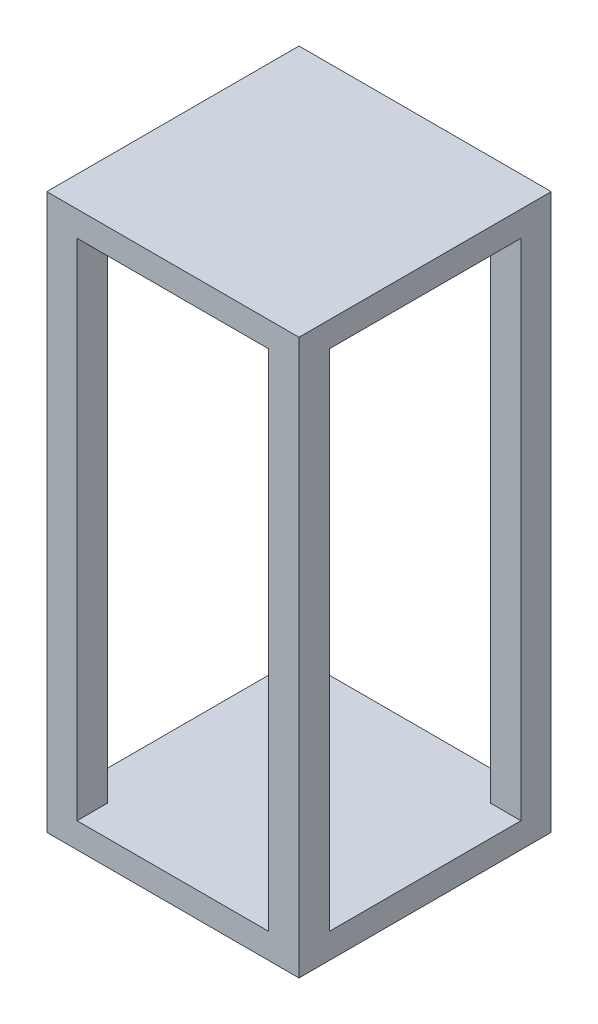
ISO-10303-21;
HEADER;
FILE_DESCRIPTION(('STEP AP214'),'2;1');
FILE_NAME('part.step','',(''),(''),'','','');
FILE_SCHEMA(('AUTOMOTIVE_DESIGN { 1 0 10303 214 1 1 1 1 }'));
ENDSEC;
DATA;
#1=APPLICATION_CONTEXT('core data for automotive mechanical design processes');
#2=APPLICATION_PROTOCOL_DEFINITION('international standard','automotive_design',2000,#1);
#3=PRODUCT_CONTEXT('',#1,'mechanical');
#4=PRODUCT('Part','Part','',(#3));
#5=PRODUCT_RELATED_PRODUCT_CATEGORY('part','',(#4));
#6=PRODUCT_DEFINITION_FORMATION('','',#4);
#7=PRODUCT_DEFINITION_CONTEXT('part definition',#1,'design');
#8=PRODUCT_DEFINITION('design','',#6,#7);
#9=PRODUCT_DEFINITION_SHAPE('','',#8);
#10=(LENGTH_UNIT() NAMED_UNIT(*) SI_UNIT(.MILLI.,.METRE.));
#11=(NAMED_UNIT(*) PLANE_ANGLE_UNIT() SI_UNIT($,.RADIAN.));
#12=(NAMED_UNIT(*) SI_UNIT($,.STERADIAN.) SOLID_ANGLE_UNIT());
#13=UNCERTAINTY_MEASURE_WITH_UNIT(LENGTH_MEASURE(1.E-05),#10,'distance_accuracy_value','');
#14=(GEOMETRIC_REPRESENTATION_CONTEXT(3) GLOBAL_UNCERTAINTY_ASSIGNED_CONTEXT((#13)) GLOBAL_UNIT_ASSIGNED_CONTEXT((#10,
#11,#12)) REPRESENTATION_CONTEXT('',''));
#15=CARTESIAN_POINT('',(0.,0.,0.));
#16=DIRECTION('',(0.,0.,1.));
#17=DIRECTION('',(1.,0.,0.));
#18=AXIS2_PLACEMENT_3D('',#15,#16,#17);
#19=CARTESIAN_POINT('',(0.,101.501356130005,1.25));
#20=DIRECTION('',(0.,0.,1.));
#21=DIRECTION('',(1.,0.,0.));
#22=AXIS2_PLACEMENT_3D('',#19,#20,#21);
#23=PLANE('',#22);
#24=CARTESIAN_POINT('',(0.,101.501356130005,1.25));
#25=DIRECTION('',(0.,0.,1.));
#26=DIRECTION('',(1.,0.,0.));
#27=AXIS2_PLACEMENT_3D('',#24,#25,#26);
#28=CIRCLE('',#27,3.9);
#29=CARTESIAN_POINT('',(3.9,101.501356130005,1.25));
#30=VERTEX_POINT('',#29);
#31=EDGE_CURVE('E11',#30,#30,#28,.F.);
#32=ORIENTED_EDGE('',*,*,#31,.T.);
#33=EDGE_LOOP('',(#32));
#34=FACE_BOUND('',#33,.T.);
#35=CARTESIAN_POINT('',(0.,101.501356130005,1.25));
#36=DIRECTION('',(0.,0.,1.));
#37=DIRECTION('',(1.,0.,0.));
#38=AXIS2_PLACEMENT_3D('',#35,#36,#37);
#39=CIRCLE('',#38,4.1);
#40=CARTESIAN_POINT('',(4.1,101.501356130005,1.25));
#41=VERTEX_POINT('',#40);
#42=EDGE_CURVE('E48',#41,#41,#39,.T.);
#43=ORIENTED_EDGE('',*,*,#42,.T.);
#44=EDGE_LOOP('',(#43));
#45=FACE_BOUND('',#44,.T.);
#46=ADVANCED_FACE('F41',(#34,#45),#23,.T.);
#47=CARTESIAN_POINT('',(0.,101.501356130005,-1.25));
#48=DIRECTION('',(0.,0.,1.));
#49=DIRECTION('',(1.,0.,0.));
#50=AXIS2_PLACEMENT_3D('',#47,#48,#49);
#51=PLANE('',#50);
#52=CARTESIAN_POINT('',(0.,101.501356130005,-1.25));
#53=DIRECTION('',(0.,0.,1.));
#54=DIRECTION('',(1.,0.,0.));
#55=AXIS2_PLACEMENT_3D('',#52,#53,#54);
#56=CIRCLE('',#55,3.9);
#57=CARTESIAN_POINT('',(3.9,101.501356130005,-1.25));
#58=VERTEX_POINT('',#57);
#59=EDGE_CURVE('E67',#58,#58,#56,.T.);
#60=ORIENTED_EDGE('',*,*,#59,.T.);
#61=EDGE_LOOP('',(#60));
#62=FACE_BOUND('',#61,.T.);
#63=CARTESIAN_POINT('',(0.,101.501356130005,-1.25));
#64=DIRECTION('',(0.,0.,1.));
#65=DIRECTION('',(1.,0.,0.));
#66=AXIS2_PLACEMENT_3D('',#63,#64,#65);
#67=CIRCLE('',#66,4.1);
#68=CARTESIAN_POINT('',(4.1,101.501356130005,-1.25));
#69=VERTEX_POINT('',#68);
#70=EDGE_CURVE('E70',#69,#69,#67,.F.);
#71=ORIENTED_EDGE('',*,*,#70,.T.);
#72=EDGE_LOOP('',(#71));
#73=FACE_BOUND('',#72,.T.);
#74=ADVANCED_FACE('F74',(#62,#73),#51,.F.);
#75=CARTESIAN_POINT('',(0.,101.501356130005,1.25));
#76=DIRECTION('',(0.,0.,-1.));
#77=DIRECTION('',(-1.,0.,0.));
#78=AXIS2_PLACEMENT_3D('',#75,#76,#77);
#79=CYLINDRICAL_SURFACE('',#78,5.);
#80=CARTESIAN_POINT('',(0.,101.501356130005,-0.35));
#81=DIRECTION('',(0.,0.,1.));
#82=DIRECTION('',(1.,0.,0.));
#83=AXIS2_PLACEMENT_3D('',#80,#81,#82);
#84=CIRCLE('',#83,5.);
#85=CARTESIAN_POINT('',(5.,101.501356130005,-0.35));
#86=VERTEX_POINT('',#85);
#87=EDGE_CURVE('E52',#86,#86,#84,.T.);
#88=ORIENTED_EDGE('',*,*,#87,.T.);
#89=EDGE_LOOP('',(#88));
#90=FACE_BOUND('',#89,.T.);
#91=CARTESIAN_POINT('',(0.,101.501356130005,0.35));
#92=DIRECTION('',(0.,0.,1.));
#93=DIRECTION('',(1.,0.,0.));
#94=AXIS2_PLACEMENT_3D('',#91,#92,#93);
#95=CIRCLE('',#94,5.);
#96=CARTESIAN_POINT('',(5.,101.501356130005,0.35));
#97=VERTEX_POINT('',#96);
#98=EDGE_CURVE('E56',#97,#97,#95,.F.);
#99=ORIENTED_EDGE('',*,*,#98,.T.);
#100=EDGE_LOOP('',(#99));
#101=FACE_BOUND('',#100,.T.);
#102=ADVANCED_FACE('F84',(#90,#101),#79,.T.);
#103=CARTESIAN_POINT('',(0.,101.501356130005,1.25));
#104=DIRECTION('',(0.,0.,-1.));
#105=DIRECTION('',(-1.,0.,0.));
#106=AXIS2_PLACEMENT_3D('',#103,#104,#105);
#107=CYLINDRICAL_SURFACE('',#106,3.);
#108=CARTESIAN_POINT('',(0.,101.501356130005,-0.35));
#109=DIRECTION('',(0.,0.,1.));
#110=DIRECTION('',(1.,0.,0.));
#111=AXIS2_PLACEMENT_3D('',#108,#109,#110);
#112=CIRCLE('',#111,3.);
#113=CARTESIAN_POINT('',(3.,101.501356130005,-0.35));
#114=VERTEX_POINT('',#113);
#115=EDGE_CURVE('E61',#114,#114,#112,.F.);
#116=ORIENTED_EDGE('',*,*,#115,.T.);
#117=EDGE_LOOP('',(#116));
#118=FACE_BOUND('',#117,.T.);
#119=CARTESIAN_POINT('',(0.,101.501356130005,0.35));
#120=DIRECTION('',(0.,0.,1.));
#121=DIRECTION('',(1.,0.,0.));
#122=AXIS2_PLACEMENT_3D('',#119,#120,#121);
#123=CIRCLE('',#122,3.);
#124=CARTESIAN_POINT('',(3.,101.501356130005,0.35));
#125=VERTEX_POINT('',#124);
#126=EDGE_CURVE('E64',#125,#125,#123,.T.);
#127=ORIENTED_EDGE('',*,*,#126,.T.);
#128=EDGE_LOOP('',(#127));
#129=FACE_BOUND('',#128,.T.);
#130=ADVANCED_FACE('F87',(#118,#129),#107,.F.);
#131=CARTESIAN_POINT('',(0.,101.501356130005,-0.35));
#132=DIRECTION('',(0.,0.,1.));
#133=DIRECTION('',(1.,0.,0.));
#134=AXIS2_PLACEMENT_3D('',#131,#132,#133);
#135=TOROIDAL_SURFACE('',#134,3.9,0.9);
#136=ORIENTED_EDGE('',*,*,#115,.F.);
#137=EDGE_LOOP('',(#136));
#138=FACE_BOUND('',#137,.T.);
#139=ORIENTED_EDGE('',*,*,#59,.F.);
#140=EDGE_LOOP('',(#139));
#141=FACE_BOUND('',#140,.T.);
#142=ADVANCED_FACE('F80',(#138,#141),#135,.T.);
#143=CARTESIAN_POINT('',(0.,101.501356130005,-0.35));
#144=DIRECTION('',(0.,0.,1.));
#145=DIRECTION('',(1.,0.,0.));
#146=AXIS2_PLACEMENT_3D('',#143,#144,#145);
#147=TOROIDAL_SURFACE('',#146,4.1,0.9);
#148=ORIENTED_EDGE('',*,*,#70,.F.);
#149=EDGE_LOOP('',(#148));
#150=FACE_BOUND('',#149,.T.);
#151=ORIENTED_EDGE('',*,*,#87,.F.);
#152=EDGE_LOOP('',(#151));
#153=FACE_BOUND('',#152,.T.);
#154=ADVANCED_FACE('F76',(#150,#153),#147,.T.);
#155=CARTESIAN_POINT('',(0.,101.501356130005,0.35));
#156=DIRECTION('',(0.,0.,1.));
#157=DIRECTION('',(1.,0.,0.));
#158=AXIS2_PLACEMENT_3D('',#155,#156,#157);
#159=TOROIDAL_SURFACE('',#158,3.9,0.9);
#160=ORIENTED_EDGE('',*,*,#31,.F.);
#161=EDGE_LOOP('',(#160));
#162=FACE_BOUND('',#161,.T.);
#163=ORIENTED_EDGE('',*,*,#126,.F.);
#164=EDGE_LOOP('',(#163));
#165=FACE_BOUND('',#164,.T.);
#166=ADVANCED_FACE('F79',(#162,#165),#159,.T.);
#167=CARTESIAN_POINT('',(0.,101.501356130005,0.35));
#168=DIRECTION('',(0.,0.,1.));
#169=DIRECTION('',(1.,0.,0.));
#170=AXIS2_PLACEMENT_3D('',#167,#168,#169);
#171=TOROIDAL_SURFACE('',#170,4.1,0.9);
#172=ORIENTED_EDGE('',*,*,#98,.F.);
#173=EDGE_LOOP('',(#172));
#174=FACE_BOUND('',#173,.T.);
#175=ORIENTED_EDGE('',*,*,#42,.F.);
#176=EDGE_LOOP('',(#175));
#177=FACE_BOUND('',#176,.T.);
#178=ADVANCED_FACE('F43',(#174,#177),#171,.T.);
#179=CLOSED_SHELL('',(#46,#74,#102,#130,#142,#154,#166,#178));
#180=MANIFOLD_SOLID_BREP('B2',#179);
#181=CARTESIAN_POINT('',(0.,5.,0.));
#182=DIRECTION('',(0.,-1.,0.));
#183=DIRECTION('',(0.,0.,-1.));
#184=AXIS2_PLACEMENT_3D('',#181,#182,#183);
#185=PLANE('',#184);
#186=DIRECTION('',(0.,0.,-1.));
#187=VECTOR('',#186,1.);
#188=CARTESIAN_POINT('',(-19.0000000000003,5.,24.9999999999998));
#189=LINE('',#188,#187);
#190=CARTESIAN_POINT('',(-19.0000000000003,5.,24.9999999999998));
#191=VERTEX_POINT('',#190);
#192=CARTESIAN_POINT('',(-19.0000000000002,5.,18.9999999999998));
#193=VERTEX_POINT('',#192);
#194=EDGE_CURVE('E312',#191,#193,#189,.T.);
#195=ORIENTED_EDGE('',*,*,#194,.F.);
#196=DIRECTION('',(1.,0.,0.));
#197=VECTOR('',#196,1.);
#198=CARTESIAN_POINT('',(-25.,5.,25.));
#199=LINE('',#198,#197);
#200=CARTESIAN_POINT('',(18.9999999999998,5.,25.));
#201=VERTEX_POINT('',#200);
#202=EDGE_CURVE('E419',#191,#201,#199,.T.);
#203=ORIENTED_EDGE('',*,*,#202,.T.);
#204=DIRECTION('',(0.,0.,1.));
#205=VECTOR('',#204,1.);
#206=CARTESIAN_POINT('',(18.9999999999998,5.,25.0000000000001));
#207=LINE('',#206,#205);
#208=CARTESIAN_POINT('',(18.9999999999999,5.,19.0000000000001));
#209=VERTEX_POINT('',#208);
#210=EDGE_CURVE('E343',#209,#201,#207,.T.);
#211=ORIENTED_EDGE('',*,*,#210,.F.);
#212=DIRECTION('',(-1.,0.,0.));
#213=VECTOR('',#212,1.);
#214=CARTESIAN_POINT('',(24.9999999999999,5.,19.0000000000002));
#215=LINE('',#214,#213);
#216=CARTESIAN_POINT('',(25.,5.,19.0000000000001));
#217=VERTEX_POINT('',#216);
#218=EDGE_CURVE('E338',#217,#209,#215,.T.);
#219=ORIENTED_EDGE('',*,*,#218,.F.);
#220=DIRECTION('',(0.,0.,-1.));
#221=VECTOR('',#220,1.);
#222=CARTESIAN_POINT('',(25.,5.,25.));
#223=LINE('',#222,#221);
#224=CARTESIAN_POINT('',(25.,5.,-18.9999999999999));
#225=VERTEX_POINT('',#224);
#226=EDGE_CURVE('E429',#217,#225,#223,.T.);
#227=ORIENTED_EDGE('',*,*,#226,.T.);
#228=DIRECTION('',(1.,0.,0.));
#229=VECTOR('',#228,1.);
#230=CARTESIAN_POINT('',(25.0000000000001,5.,-18.9999999999999));
#231=LINE('',#230,#229);
#232=CARTESIAN_POINT('',(19.0000000000001,5.,-18.9999999999999));
#233=VERTEX_POINT('',#232);
#234=EDGE_CURVE('E364',#233,#225,#231,.T.);
#235=ORIENTED_EDGE('',*,*,#234,.F.);
#236=DIRECTION('',(0.,0.,1.));
#237=VECTOR('',#236,1.);
#238=CARTESIAN_POINT('',(19.0000000000001,5.,-24.9999999999999));
#239=LINE('',#238,#237);
#240=CARTESIAN_POINT('',(19.0000000000001,5.,-24.9999999999999));
#241=VERTEX_POINT('',#240);
#242=EDGE_CURVE('E359',#241,#233,#239,.T.);
#243=ORIENTED_EDGE('',*,*,#242,.F.);
#244=DIRECTION('',(-1.,0.,0.));
#245=VECTOR('',#244,1.);
#246=CARTESIAN_POINT('',(-25.,5.,-25.));
#247=LINE('',#246,#245);
#248=CARTESIAN_POINT('',(-19.,5.,-25.));
#249=VERTEX_POINT('',#248);
#250=EDGE_CURVE('E167',#241,#249,#247,.T.);
#251=ORIENTED_EDGE('',*,*,#250,.T.);
#252=DIRECTION('',(0.,0.,-1.));
#253=VECTOR('',#252,1.);
#254=CARTESIAN_POINT('',(-19.,5.,-25.));
#255=LINE('',#254,#253);
#256=CARTESIAN_POINT('',(-19.,5.,-19.));
#257=VERTEX_POINT('',#256);
#258=EDGE_CURVE('E385',#257,#249,#255,.T.);
#259=ORIENTED_EDGE('',*,*,#258,.F.);
#260=DIRECTION('',(1.,0.,0.));
#261=VECTOR('',#260,1.);
#262=CARTESIAN_POINT('',(-25.,5.,-19.));
#263=LINE('',#262,#261);
#264=CARTESIAN_POINT('',(-25.,5.,-19.));
#265=VERTEX_POINT('',#264);
#266=EDGE_CURVE('E380',#265,#257,#263,.T.);
#267=ORIENTED_EDGE('',*,*,#266,.F.);
#268=DIRECTION('',(0.,0.,1.));
#269=VECTOR('',#268,1.);
#270=CARTESIAN_POINT('',(-25.,5.,25.));
#271=LINE('',#270,#269);
#272=CARTESIAN_POINT('',(-25.,5.,18.9999999999997));
#273=VERTEX_POINT('',#272);
#274=EDGE_CURVE('E186',#265,#273,#271,.T.);
#275=ORIENTED_EDGE('',*,*,#274,.T.);
#276=DIRECTION('',(-1.,0.,0.));
#277=VECTOR('',#276,1.);
#278=CARTESIAN_POINT('',(-25.0000000000002,5.,18.9999999999997));
#279=LINE('',#278,#277);
#280=EDGE_CURVE('E181',#193,#273,#279,.T.);
#281=ORIENTED_EDGE('',*,*,#280,.F.);
#282=EDGE_LOOP('',(#195,#203,#211,#219,#227,#235,#243,#251,#259,#267,#275,#281));
#283=FACE_BOUND('',#282,.T.);
#284=ADVANCED_FACE('F163',(#283),#185,.F.);
#285=CARTESIAN_POINT('',(25.,5.,25.));
#286=DIRECTION('',(-1.,0.,0.));
#287=DIRECTION('',(0.,0.,1.));
#288=AXIS2_PLACEMENT_3D('',#285,#286,#287);
#289=PLANE('',#288);
#290=DIRECTION('',(0.,-1.,0.));
#291=VECTOR('',#290,1.);
#292=CARTESIAN_POINT('',(25.,5.,-25.));
#293=LINE('',#292,#291);
#294=CARTESIAN_POINT('',(24.9999999999998,110.,-25.));
#295=VERTEX_POINT('',#294);
#296=CARTESIAN_POINT('',(25.,0.,-25.));
#297=VERTEX_POINT('',#296);
#298=EDGE_CURVE('E39',#295,#297,#293,.T.);
#299=ORIENTED_EDGE('',*,*,#298,.F.);
#300=DIRECTION('',(0.,0.,-1.));
#301=VECTOR('',#300,1.);
#302=CARTESIAN_POINT('',(24.9999999999998,110.,-25.));
#303=LINE('',#302,#301);
#304=CARTESIAN_POINT('',(24.9999999999998,110.,25.0000000000002));
#305=VERTEX_POINT('',#304);
#306=EDGE_CURVE('E298',#305,#295,#303,.T.);
#307=ORIENTED_EDGE('',*,*,#306,.F.);
#308=DIRECTION('',(0.,-1.,0.));
#309=VECTOR('',#308,1.);
#310=CARTESIAN_POINT('',(25.,5.,25.));
#311=LINE('',#310,#309);
#312=CARTESIAN_POINT('',(25.,0.,25.));
#313=VERTEX_POINT('',#312);
#314=EDGE_CURVE('E288',#305,#313,#311,.T.);
#315=ORIENTED_EDGE('',*,*,#314,.T.);
#316=DIRECTION('',(0.,0.,-1.));
#317=VECTOR('',#316,1.);
#318=CARTESIAN_POINT('',(25.,0.,25.));
#319=LINE('',#318,#317);
#320=EDGE_CURVE('E407',#313,#297,#319,.T.);
#321=ORIENTED_EDGE('',*,*,#320,.T.);
#322=EDGE_LOOP('',(#299,#307,#315,#321));
#323=FACE_BOUND('',#322,.T.);
#324=DIRECTION('',(0.,0.,-1.));
#325=VECTOR('',#324,1.);
#326=CARTESIAN_POINT('',(24.9999999999998,105.,-25.));
#327=LINE('',#326,#325);
#328=CARTESIAN_POINT('',(24.9999999999998,105.,19.0000000000001));
#329=VERTEX_POINT('',#328);
#330=CARTESIAN_POINT('',(25.0000000000001,105.,-18.9999999999999));
#331=VERTEX_POINT('',#330);
#332=EDGE_CURVE('E307',#329,#331,#327,.T.);
#333=ORIENTED_EDGE('',*,*,#332,.T.);
#334=DIRECTION('',(0.,-1.,0.));
#335=VECTOR('',#334,1.);
#336=CARTESIAN_POINT('',(25.0000000000001,105.,-18.9999999999999));
#337=LINE('',#336,#335);
#338=EDGE_CURVE('E367',#331,#225,#337,.T.);
#339=ORIENTED_EDGE('',*,*,#338,.T.);
#340=ORIENTED_EDGE('',*,*,#226,.F.);
#341=DIRECTION('',(0.,-1.,0.));
#342=VECTOR('',#341,1.);
#343=CARTESIAN_POINT('',(24.9999999999999,105.,19.0000000000002));
#344=LINE('',#343,#342);
#345=EDGE_CURVE('E356',#329,#217,#344,.T.);
#346=ORIENTED_EDGE('',*,*,#345,.F.);
#347=EDGE_LOOP('',(#333,#339,#340,#346));
#348=FACE_BOUND('',#347,.T.);
#349=ADVANCED_FACE('F165',(#323,#348),#289,.F.);
#350=CARTESIAN_POINT('',(-25.,5.,-25.));
#351=DIRECTION('',(0.,0.,1.));
#352=DIRECTION('',(1.,0.,0.));
#353=AXIS2_PLACEMENT_3D('',#350,#351,#352);
#354=PLANE('',#353);
#355=DIRECTION('',(0.,-1.,0.));
#356=VECTOR('',#355,1.);
#357=CARTESIAN_POINT('',(-25.,5.,-25.));
#358=LINE('',#357,#356);
#359=CARTESIAN_POINT('',(-25.,110.,-25.));
#360=VERTEX_POINT('',#359);
#361=CARTESIAN_POINT('',(-25.,0.,-25.));
#362=VERTEX_POINT('',#361);
#363=EDGE_CURVE('E173',#360,#362,#358,.T.);
#364=ORIENTED_EDGE('',*,*,#363,.F.);
#365=DIRECTION('',(-1.,0.,0.));
#366=VECTOR('',#365,1.);
#367=CARTESIAN_POINT('',(-25.,110.,-25.));
#368=LINE('',#367,#366);
#369=EDGE_CURVE('E303',#295,#360,#368,.T.);
#370=ORIENTED_EDGE('',*,*,#369,.F.);
#371=ORIENTED_EDGE('',*,*,#298,.T.);
#372=DIRECTION('',(-1.,0.,0.));
#373=VECTOR('',#372,1.);
#374=CARTESIAN_POINT('',(-25.,0.,-25.));
#375=LINE('',#374,#373);
#376=EDGE_CURVE('E412',#297,#362,#375,.T.);
#377=ORIENTED_EDGE('',*,*,#376,.T.);
#378=EDGE_LOOP('',(#364,#370,#371,#377));
#379=FACE_BOUND('',#378,.T.);
#380=DIRECTION('',(-1.,0.,0.));
#381=VECTOR('',#380,1.);
#382=CARTESIAN_POINT('',(-25.,105.,-25.));
#383=LINE('',#382,#381);
#384=CARTESIAN_POINT('',(19.0000000000001,105.,-25.));
#385=VERTEX_POINT('',#384);
#386=CARTESIAN_POINT('',(-19.,105.,-25.));
#387=VERTEX_POINT('',#386);
#388=EDGE_CURVE('E304',#385,#387,#383,.T.);
#389=ORIENTED_EDGE('',*,*,#388,.T.);
#390=DIRECTION('',(0.,-1.,0.));
#391=VECTOR('',#390,1.);
#392=CARTESIAN_POINT('',(-19.,105.,-25.));
#393=LINE('',#392,#391);
#394=EDGE_CURVE('E388',#387,#249,#393,.T.);
#395=ORIENTED_EDGE('',*,*,#394,.T.);
#396=ORIENTED_EDGE('',*,*,#250,.F.);
#397=DIRECTION('',(0.,-1.,0.));
#398=VECTOR('',#397,1.);
#399=CARTESIAN_POINT('',(19.0000000000001,105.,-24.9999999999999));
#400=LINE('',#399,#398);
#401=EDGE_CURVE('E377',#385,#241,#400,.T.);
#402=ORIENTED_EDGE('',*,*,#401,.F.);
#403=EDGE_LOOP('',(#389,#395,#396,#402));
#404=FACE_BOUND('',#403,.T.);
#405=ADVANCED_FACE('F436',(#379,#404),#354,.F.);
#406=CARTESIAN_POINT('',(-25.,5.,25.));
#407=DIRECTION('',(1.,0.,0.));
#408=DIRECTION('',(0.,0.,-1.));
#409=AXIS2_PLACEMENT_3D('',#406,#407,#408);
#410=PLANE('',#409);
#411=DIRECTION('',(0.,-1.,0.));
#412=VECTOR('',#411,1.);
#413=CARTESIAN_POINT('',(-25.,105.,-19.));
#414=LINE('',#413,#412);
#415=CARTESIAN_POINT('',(-25.,105.,-19.));
#416=VERTEX_POINT('',#415);
#417=EDGE_CURVE('E403',#416,#265,#414,.T.);
#418=ORIENTED_EDGE('',*,*,#417,.F.);
#419=DIRECTION('',(0.,0.,1.));
#420=VECTOR('',#419,1.);
#421=CARTESIAN_POINT('',(-25.,105.,-25.));
#422=LINE('',#421,#420);
#423=CARTESIAN_POINT('',(-25.0000000000002,105.,18.9999999999997));
#424=VERTEX_POINT('',#423);
#425=EDGE_CURVE('E313',#416,#424,#422,.T.);
#426=ORIENTED_EDGE('',*,*,#425,.T.);
#427=DIRECTION('',(0.,-1.,0.));
#428=VECTOR('',#427,1.);
#429=CARTESIAN_POINT('',(-25.0000000000002,105.,18.9999999999997));
#430=LINE('',#429,#428);
#431=EDGE_CURVE('E327',#424,#273,#430,.T.);
#432=ORIENTED_EDGE('',*,*,#431,.T.);
#433=ORIENTED_EDGE('',*,*,#274,.F.);
#434=EDGE_LOOP('',(#418,#426,#432,#433));
#435=FACE_BOUND('',#434,.T.);
#436=DIRECTION('',(0.,0.,1.));
#437=VECTOR('',#436,1.);
#438=CARTESIAN_POINT('',(-25.,0.,25.));
#439=LINE('',#438,#437);
#440=CARTESIAN_POINT('',(-25.,0.,25.));
#441=VERTEX_POINT('',#440);
#442=EDGE_CURVE('E285',#362,#441,#439,.T.);
#443=ORIENTED_EDGE('',*,*,#442,.T.);
#444=DIRECTION('',(0.,-1.,0.));
#445=VECTOR('',#444,1.);
#446=CARTESIAN_POINT('',(-25.,5.,25.));
#447=LINE('',#446,#445);
#448=CARTESIAN_POINT('',(-25.,110.,25.0000000000002));
#449=VERTEX_POINT('',#448);
#450=EDGE_CURVE('E278',#449,#441,#447,.T.);
#451=ORIENTED_EDGE('',*,*,#450,.F.);
#452=DIRECTION('',(0.,0.,1.));
#453=VECTOR('',#452,1.);
#454=CARTESIAN_POINT('',(-25.,110.,-25.));
#455=LINE('',#454,#453);
#456=EDGE_CURVE('E283',#360,#449,#455,.T.);
#457=ORIENTED_EDGE('',*,*,#456,.F.);
#458=ORIENTED_EDGE('',*,*,#363,.T.);
#459=EDGE_LOOP('',(#443,#451,#457,#458));
#460=FACE_BOUND('',#459,.T.);
#461=ADVANCED_FACE('F280',(#435,#460),#410,.F.);
#462=CARTESIAN_POINT('',(-25.,5.,25.));
#463=DIRECTION('',(0.,0.,-1.));
#464=DIRECTION('',(-1.,0.,0.));
#465=AXIS2_PLACEMENT_3D('',#462,#463,#464);
#466=PLANE('',#465);
#467=ORIENTED_EDGE('',*,*,#314,.F.);
#468=DIRECTION('',(1.,0.,0.));
#469=VECTOR('',#468,1.);
#470=CARTESIAN_POINT('',(-25.,110.,25.0000000000002));
#471=LINE('',#470,#469);
#472=EDGE_CURVE('E291',#449,#305,#471,.T.);
#473=ORIENTED_EDGE('',*,*,#472,.F.);
#474=ORIENTED_EDGE('',*,*,#450,.T.);
#475=DIRECTION('',(1.,0.,0.));
#476=VECTOR('',#475,1.);
#477=CARTESIAN_POINT('',(-25.,0.,25.));
#478=LINE('',#477,#476);
#479=EDGE_CURVE('E427',#441,#313,#478,.T.);
#480=ORIENTED_EDGE('',*,*,#479,.T.);
#481=EDGE_LOOP('',(#467,#473,#474,#480));
#482=FACE_BOUND('',#481,.T.);
#483=DIRECTION('',(1.,0.,0.));
#484=VECTOR('',#483,1.);
#485=CARTESIAN_POINT('',(-25.,105.,25.0000000000002));
#486=LINE('',#485,#484);
#487=CARTESIAN_POINT('',(-19.0000000000002,105.,25.0000000000002));
#488=VERTEX_POINT('',#487);
#489=CARTESIAN_POINT('',(18.9999999999998,105.,25.0000000000001));
#490=VERTEX_POINT('',#489);
#491=EDGE_CURVE('E316',#488,#490,#486,.T.);
#492=ORIENTED_EDGE('',*,*,#491,.T.);
#493=DIRECTION('',(0.,-1.,0.));
#494=VECTOR('',#493,1.);
#495=CARTESIAN_POINT('',(18.9999999999998,105.,25.0000000000001));
#496=LINE('',#495,#494);
#497=EDGE_CURVE('E346',#490,#201,#496,.T.);
#498=ORIENTED_EDGE('',*,*,#497,.T.);
#499=ORIENTED_EDGE('',*,*,#202,.F.);
#500=DIRECTION('',(0.,-1.,0.));
#501=VECTOR('',#500,1.);
#502=CARTESIAN_POINT('',(-19.0000000000003,105.,24.9999999999998));
#503=LINE('',#502,#501);
#504=EDGE_CURVE('E335',#488,#191,#503,.T.);
#505=ORIENTED_EDGE('',*,*,#504,.F.);
#506=EDGE_LOOP('',(#492,#498,#499,#505));
#507=FACE_BOUND('',#506,.T.);
#508=ADVANCED_FACE('F292',(#482,#507),#466,.F.);
#509=CARTESIAN_POINT('',(0.,0.,0.));
#510=DIRECTION('',(0.,-1.,0.));
#511=DIRECTION('',(0.,0.,-1.));
#512=AXIS2_PLACEMENT_3D('',#509,#510,#511);
#513=PLANE('',#512);
#514=ORIENTED_EDGE('',*,*,#320,.F.);
#515=ORIENTED_EDGE('',*,*,#479,.F.);
#516=ORIENTED_EDGE('',*,*,#442,.F.);
#517=ORIENTED_EDGE('',*,*,#376,.F.);
#518=EDGE_LOOP('',(#514,#515,#516,#517));
#519=FACE_BOUND('',#518,.T.);
#520=ADVANCED_FACE('F433',(#519),#513,.T.);
#521=CARTESIAN_POINT('',(-25.,105.,-19.));
#522=DIRECTION('',(0.,0.,-1.));
#523=DIRECTION('',(-1.,0.,0.));
#524=AXIS2_PLACEMENT_3D('',#521,#522,#523);
#525=PLANE('',#524);
#526=ORIENTED_EDGE('',*,*,#266,.T.);
#527=DIRECTION('',(0.,-1.,0.));
#528=VECTOR('',#527,1.);
#529=CARTESIAN_POINT('',(-19.,105.,-19.));
#530=LINE('',#529,#528);
#531=CARTESIAN_POINT('',(-19.,105.,-19.));
#532=VERTEX_POINT('',#531);
#533=EDGE_CURVE('E391',#532,#257,#530,.T.);
#534=ORIENTED_EDGE('',*,*,#533,.F.);
#535=DIRECTION('',(1.,0.,0.));
#536=VECTOR('',#535,1.);
#537=CARTESIAN_POINT('',(-25.,105.,-19.));
#538=LINE('',#537,#536);
#539=EDGE_CURVE('E381',#416,#532,#538,.T.);
#540=ORIENTED_EDGE('',*,*,#539,.F.);
#541=ORIENTED_EDGE('',*,*,#417,.T.);
#542=EDGE_LOOP('',(#526,#534,#540,#541));
#543=FACE_BOUND('',#542,.T.);
#544=ADVANCED_FACE('F445',(#543),#525,.F.);
#545=CARTESIAN_POINT('',(-19.,105.,-25.));
#546=DIRECTION('',(-1.,0.,0.));
#547=DIRECTION('',(0.,0.,1.));
#548=AXIS2_PLACEMENT_3D('',#545,#546,#547);
#549=PLANE('',#548);
#550=ORIENTED_EDGE('',*,*,#258,.T.);
#551=ORIENTED_EDGE('',*,*,#394,.F.);
#552=DIRECTION('',(0.,0.,-1.));
#553=VECTOR('',#552,1.);
#554=CARTESIAN_POINT('',(-19.,105.,-25.));
#555=LINE('',#554,#553);
#556=EDGE_CURVE('E384',#532,#387,#555,.T.);
#557=ORIENTED_EDGE('',*,*,#556,.F.);
#558=ORIENTED_EDGE('',*,*,#533,.T.);
#559=EDGE_LOOP('',(#550,#551,#557,#558));
#560=FACE_BOUND('',#559,.T.);
#561=ADVANCED_FACE('F443',(#560),#549,.F.);
#562=CARTESIAN_POINT('',(19.0000000000001,105.,-24.9999999999999));
#563=DIRECTION('',(1.,0.,0.));
#564=DIRECTION('',(0.,0.,-1.));
#565=AXIS2_PLACEMENT_3D('',#562,#563,#564);
#566=PLANE('',#565);
#567=ORIENTED_EDGE('',*,*,#242,.T.);
#568=DIRECTION('',(0.,-1.,0.));
#569=VECTOR('',#568,1.);
#570=CARTESIAN_POINT('',(19.0000000000001,105.,-18.9999999999999));
#571=LINE('',#570,#569);
#572=CARTESIAN_POINT('',(19.0000000000001,105.,-18.9999999999999));
#573=VERTEX_POINT('',#572);
#574=EDGE_CURVE('E374',#573,#233,#571,.T.);
#575=ORIENTED_EDGE('',*,*,#574,.F.);
#576=DIRECTION('',(0.,0.,1.));
#577=VECTOR('',#576,1.);
#578=CARTESIAN_POINT('',(19.0000000000001,105.,-24.9999999999999));
#579=LINE('',#578,#577);
#580=EDGE_CURVE('E360',#385,#573,#579,.T.);
#581=ORIENTED_EDGE('',*,*,#580,.F.);
#582=ORIENTED_EDGE('',*,*,#401,.T.);
#583=EDGE_LOOP('',(#567,#575,#581,#582));
#584=FACE_BOUND('',#583,.T.);
#585=ADVANCED_FACE('F466',(#584),#566,.F.);
#586=CARTESIAN_POINT('',(25.0000000000001,105.,-18.9999999999999));
#587=DIRECTION('',(0.,0.,-1.));
#588=DIRECTION('',(-1.,0.,0.));
#589=AXIS2_PLACEMENT_3D('',#586,#587,#588);
#590=PLANE('',#589);
#591=ORIENTED_EDGE('',*,*,#234,.T.);
#592=ORIENTED_EDGE('',*,*,#338,.F.);
#593=DIRECTION('',(1.,0.,0.));
#594=VECTOR('',#593,1.);
#595=CARTESIAN_POINT('',(25.0000000000001,105.,-18.9999999999999));
#596=LINE('',#595,#594);
#597=EDGE_CURVE('E363',#573,#331,#596,.T.);
#598=ORIENTED_EDGE('',*,*,#597,.F.);
#599=ORIENTED_EDGE('',*,*,#574,.T.);
#600=EDGE_LOOP('',(#591,#592,#598,#599));
#601=FACE_BOUND('',#600,.T.);
#602=ADVANCED_FACE('F463',(#601),#590,.F.);
#603=CARTESIAN_POINT('',(24.9999999999999,105.,19.0000000000002));
#604=DIRECTION('',(0.,0.,1.));
#605=DIRECTION('',(1.,0.,0.));
#606=AXIS2_PLACEMENT_3D('',#603,#604,#605);
#607=PLANE('',#606);
#608=ORIENTED_EDGE('',*,*,#218,.T.);
#609=DIRECTION('',(0.,-1.,0.));
#610=VECTOR('',#609,1.);
#611=CARTESIAN_POINT('',(18.9999999999999,105.,19.0000000000001));
#612=LINE('',#611,#610);
#613=CARTESIAN_POINT('',(18.9999999999999,105.,19.0000000000001));
#614=VERTEX_POINT('',#613);
#615=EDGE_CURVE('E353',#614,#209,#612,.T.);
#616=ORIENTED_EDGE('',*,*,#615,.F.);
#617=DIRECTION('',(-1.,0.,0.));
#618=VECTOR('',#617,1.);
#619=CARTESIAN_POINT('',(24.9999999999999,105.,19.0000000000002));
#620=LINE('',#619,#618);
#621=EDGE_CURVE('E339',#329,#614,#620,.T.);
#622=ORIENTED_EDGE('',*,*,#621,.F.);
#623=ORIENTED_EDGE('',*,*,#345,.T.);
#624=EDGE_LOOP('',(#608,#616,#622,#623));
#625=FACE_BOUND('',#624,.T.);
#626=ADVANCED_FACE('F460',(#625),#607,.F.);
#627=CARTESIAN_POINT('',(18.9999999999998,105.,25.0000000000001));
#628=DIRECTION('',(1.,0.,0.));
#629=DIRECTION('',(0.,0.,-1.));
#630=AXIS2_PLACEMENT_3D('',#627,#628,#629);
#631=PLANE('',#630);
#632=ORIENTED_EDGE('',*,*,#210,.T.);
#633=ORIENTED_EDGE('',*,*,#497,.F.);
#634=DIRECTION('',(0.,0.,1.));
#635=VECTOR('',#634,1.);
#636=CARTESIAN_POINT('',(18.9999999999998,105.,25.0000000000001));
#637=LINE('',#636,#635);
#638=EDGE_CURVE('E342',#614,#490,#637,.T.);
#639=ORIENTED_EDGE('',*,*,#638,.F.);
#640=ORIENTED_EDGE('',*,*,#615,.T.);
#641=EDGE_LOOP('',(#632,#633,#639,#640));
#642=FACE_BOUND('',#641,.T.);
#643=ADVANCED_FACE('F455',(#642),#631,.F.);
#644=CARTESIAN_POINT('',(-19.0000000000003,105.,24.9999999999998));
#645=DIRECTION('',(-1.,0.,0.));
#646=DIRECTION('',(0.,0.,1.));
#647=AXIS2_PLACEMENT_3D('',#644,#645,#646);
#648=PLANE('',#647);
#649=ORIENTED_EDGE('',*,*,#194,.T.);
#650=DIRECTION('',(0.,-1.,0.));
#651=VECTOR('',#650,1.);
#652=CARTESIAN_POINT('',(-19.0000000000002,105.,18.9999999999998));
#653=LINE('',#652,#651);
#654=CARTESIAN_POINT('',(-19.0000000000002,105.,18.9999999999998));
#655=VERTEX_POINT('',#654);
#656=EDGE_CURVE('E332',#655,#193,#653,.T.);
#657=ORIENTED_EDGE('',*,*,#656,.F.);
#658=DIRECTION('',(0.,0.,-1.));
#659=VECTOR('',#658,1.);
#660=CARTESIAN_POINT('',(-19.0000000000003,105.,24.9999999999998));
#661=LINE('',#660,#659);
#662=EDGE_CURVE('E321',#488,#655,#661,.T.);
#663=ORIENTED_EDGE('',*,*,#662,.F.);
#664=ORIENTED_EDGE('',*,*,#504,.T.);
#665=EDGE_LOOP('',(#649,#657,#663,#664));
#666=FACE_BOUND('',#665,.T.);
#667=ADVANCED_FACE('F452',(#666),#648,.F.);
#668=CARTESIAN_POINT('',(-25.0000000000002,105.,18.9999999999997));
#669=DIRECTION('',(0.,0.,1.));
#670=DIRECTION('',(1.,0.,0.));
#671=AXIS2_PLACEMENT_3D('',#668,#669,#670);
#672=PLANE('',#671);
#673=ORIENTED_EDGE('',*,*,#280,.T.);
#674=ORIENTED_EDGE('',*,*,#431,.F.);
#675=DIRECTION('',(-1.,0.,0.));
#676=VECTOR('',#675,1.);
#677=CARTESIAN_POINT('',(-25.0000000000002,105.,18.9999999999997));
#678=LINE('',#677,#676);
#679=EDGE_CURVE('E324',#655,#424,#678,.T.);
#680=ORIENTED_EDGE('',*,*,#679,.F.);
#681=ORIENTED_EDGE('',*,*,#656,.T.);
#682=EDGE_LOOP('',(#673,#674,#680,#681));
#683=FACE_BOUND('',#682,.T.);
#684=ADVANCED_FACE('F450',(#683),#672,.F.);
#685=CARTESIAN_POINT('',(0.,105.,0.));
#686=DIRECTION('',(0.,1.,0.));
#687=DIRECTION('',(0.,0.,1.));
#688=AXIS2_PLACEMENT_3D('',#685,#686,#687);
#689=PLANE('',#688);
#690=ORIENTED_EDGE('',*,*,#425,.F.);
#691=ORIENTED_EDGE('',*,*,#539,.T.);
#692=ORIENTED_EDGE('',*,*,#556,.T.);
#693=ORIENTED_EDGE('',*,*,#388,.F.);
#694=ORIENTED_EDGE('',*,*,#580,.T.);
#695=ORIENTED_EDGE('',*,*,#597,.T.);
#696=ORIENTED_EDGE('',*,*,#332,.F.);
#697=ORIENTED_EDGE('',*,*,#621,.T.);
#698=ORIENTED_EDGE('',*,*,#638,.T.);
#699=ORIENTED_EDGE('',*,*,#491,.F.);
#700=ORIENTED_EDGE('',*,*,#662,.T.);
#701=ORIENTED_EDGE('',*,*,#679,.T.);
#702=EDGE_LOOP('',(#690,#691,#692,#693,#694,#695,#696,#697,#698,#699,#700,#701));
#703=FACE_BOUND('',#702,.T.);
#704=ADVANCED_FACE('F442',(#703),#689,.F.);
#705=CARTESIAN_POINT('',(0.,110.,0.));
#706=DIRECTION('',(0.,1.,0.));
#707=DIRECTION('',(0.,0.,1.));
#708=AXIS2_PLACEMENT_3D('',#705,#706,#707);
#709=PLANE('',#708);
#710=ORIENTED_EDGE('',*,*,#456,.T.);
#711=ORIENTED_EDGE('',*,*,#472,.T.);
#712=ORIENTED_EDGE('',*,*,#306,.T.);
#713=ORIENTED_EDGE('',*,*,#369,.T.);
#714=EDGE_LOOP('',(#710,#711,#712,#713));
#715=FACE_BOUND('',#714,.T.);
#716=ADVANCED_FACE('F301',(#715),#709,.T.);
#717=CLOSED_SHELL('',(#284,#349,#405,#461,#508,#520,#544,#561,#585,#602,#626,#643,#667,#684,
#704,#716));
#718=MANIFOLD_SOLID_BREP('B6',#717);
#719=ADVANCED_BREP_SHAPE_REPRESENTATION('',(#18,#180,#718),#14);
#720=SHAPE_DEFINITION_REPRESENTATION(#9,#719);
ENDSEC;
END-ISO-10303-21;
